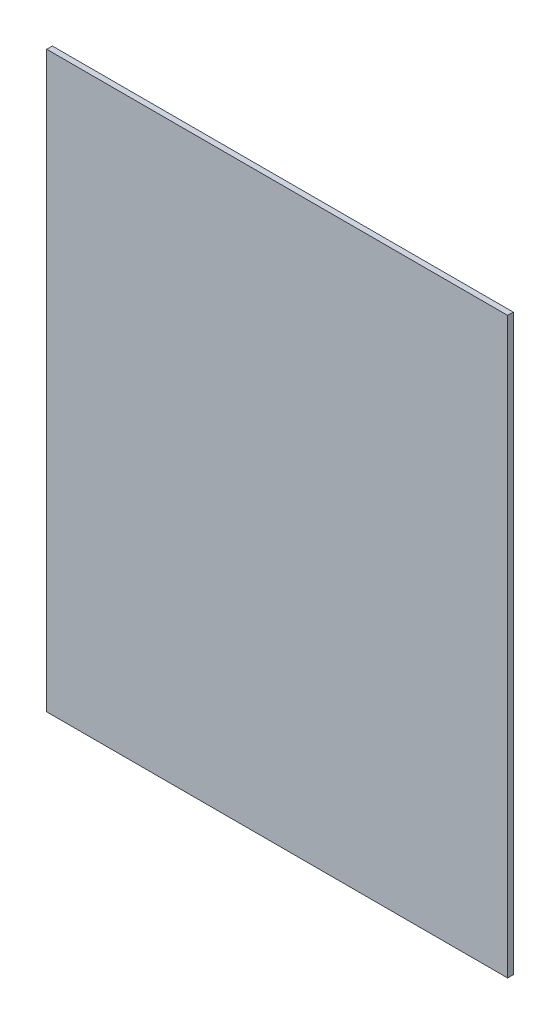
ISO-10303-21;
HEADER;
FILE_DESCRIPTION(('STEP AP214'),'2;1');
FILE_NAME('part.step','',(''),(''),'','','');
FILE_SCHEMA(('AUTOMOTIVE_DESIGN { 1 0 10303 214 1 1 1 1 }'));
ENDSEC;
DATA;
#1=APPLICATION_CONTEXT('core data for automotive mechanical design processes');
#2=APPLICATION_PROTOCOL_DEFINITION('international standard','automotive_design',2000,#1);
#3=PRODUCT_CONTEXT('',#1,'mechanical');
#4=PRODUCT('Part','Part','',(#3));
#5=PRODUCT_RELATED_PRODUCT_CATEGORY('part','',(#4));
#6=PRODUCT_DEFINITION_FORMATION('','',#4);
#7=PRODUCT_DEFINITION_CONTEXT('part definition',#1,'design');
#8=PRODUCT_DEFINITION('design','',#6,#7);
#9=PRODUCT_DEFINITION_SHAPE('','',#8);
#10=(LENGTH_UNIT() NAMED_UNIT(*) SI_UNIT(.MILLI.,.METRE.));
#11=(NAMED_UNIT(*) PLANE_ANGLE_UNIT() SI_UNIT($,.RADIAN.));
#12=(NAMED_UNIT(*) SI_UNIT($,.STERADIAN.) SOLID_ANGLE_UNIT());
#13=UNCERTAINTY_MEASURE_WITH_UNIT(LENGTH_MEASURE(1.E-05),#10,'distance_accuracy_value','');
#14=(GEOMETRIC_REPRESENTATION_CONTEXT(3) GLOBAL_UNCERTAINTY_ASSIGNED_CONTEXT((#13)) GLOBAL_UNIT_ASSIGNED_CONTEXT((#10,
#11,#12)) REPRESENTATION_CONTEXT('',''));
#15=CARTESIAN_POINT('',(0.,0.,0.));
#16=DIRECTION('',(0.,0.,1.));
#17=DIRECTION('',(1.,0.,0.));
#18=AXIS2_PLACEMENT_3D('',#15,#16,#17);
#19=CARTESIAN_POINT('',(0.,498.,4.9));
#20=DIRECTION('',(0.,1.,0.));
#21=DIRECTION('',(0.,0.,1.));
#22=AXIS2_PLACEMENT_3D('',#19,#20,#21);
#23=PLANE('',#22);
#24=DIRECTION('',(1.,0.,0.));
#25=VECTOR('',#24,1.);
#26=CARTESIAN_POINT('',(0.,498.,0.));
#27=LINE('',#26,#25);
#28=CARTESIAN_POINT('',(0.,498.,0.));
#29=VERTEX_POINT('',#28);
#30=CARTESIAN_POINT('',(400.,498.,0.));
#31=VERTEX_POINT('',#30);
#32=EDGE_CURVE('E99',#29,#31,#27,.T.);
#33=ORIENTED_EDGE('',*,*,#32,.F.);
#34=DIRECTION('',(0.,0.,-1.));
#35=VECTOR('',#34,1.);
#36=CARTESIAN_POINT('',(0.,498.,4.9));
#37=LINE('',#36,#35);
#38=CARTESIAN_POINT('',(0.,498.,4.9));
#39=VERTEX_POINT('',#38);
#40=EDGE_CURVE('E11',#39,#29,#37,.T.);
#41=ORIENTED_EDGE('',*,*,#40,.F.);
#42=DIRECTION('',(1.,0.,0.));
#43=VECTOR('',#42,1.);
#44=CARTESIAN_POINT('',(0.,498.,4.9));
#45=LINE('',#44,#43);
#46=CARTESIAN_POINT('',(400.,498.,4.9));
#47=VERTEX_POINT('',#46);
#48=EDGE_CURVE('E93',#39,#47,#45,.T.);
#49=ORIENTED_EDGE('',*,*,#48,.T.);
#50=DIRECTION('',(0.,0.,-1.));
#51=VECTOR('',#50,1.);
#52=CARTESIAN_POINT('',(400.,498.,4.9));
#53=LINE('',#52,#51);
#54=EDGE_CURVE('E38',#47,#31,#53,.T.);
#55=ORIENTED_EDGE('',*,*,#54,.T.);
#56=EDGE_LOOP('',(#33,#41,#49,#55));
#57=FACE_BOUND('',#56,.T.);
#58=ADVANCED_FACE('F35',(#57),#23,.T.);
#59=CARTESIAN_POINT('',(0.,0.,4.9));
#60=DIRECTION('',(-1.,0.,0.));
#61=DIRECTION('',(0.,0.,1.));
#62=AXIS2_PLACEMENT_3D('',#59,#60,#61);
#63=PLANE('',#62);
#64=DIRECTION('',(0.,1.,0.));
#65=VECTOR('',#64,1.);
#66=CARTESIAN_POINT('',(0.,0.,0.));
#67=LINE('',#66,#65);
#68=CARTESIAN_POINT('',(0.,0.,0.));
#69=VERTEX_POINT('',#68);
#70=EDGE_CURVE('E95',#69,#29,#67,.T.);
#71=ORIENTED_EDGE('',*,*,#70,.F.);
#72=DIRECTION('',(0.,0.,-1.));
#73=VECTOR('',#72,1.);
#74=CARTESIAN_POINT('',(0.,0.,4.9));
#75=LINE('',#74,#73);
#76=CARTESIAN_POINT('',(0.,0.,4.9));
#77=VERTEX_POINT('',#76);
#78=EDGE_CURVE('E44',#77,#69,#75,.T.);
#79=ORIENTED_EDGE('',*,*,#78,.F.);
#80=DIRECTION('',(0.,1.,0.));
#81=VECTOR('',#80,1.);
#82=CARTESIAN_POINT('',(0.,0.,4.9));
#83=LINE('',#82,#81);
#84=EDGE_CURVE('E83',#77,#39,#83,.T.);
#85=ORIENTED_EDGE('',*,*,#84,.T.);
#86=ORIENTED_EDGE('',*,*,#40,.T.);
#87=EDGE_LOOP('',(#71,#79,#85,#86));
#88=FACE_BOUND('',#87,.T.);
#89=ADVANCED_FACE('F109',(#88),#63,.T.);
#90=CARTESIAN_POINT('',(0.,0.,4.9));
#91=DIRECTION('',(0.,1.,0.));
#92=DIRECTION('',(0.,0.,1.));
#93=AXIS2_PLACEMENT_3D('',#90,#91,#92);
#94=PLANE('',#93);
#95=DIRECTION('',(1.,0.,0.));
#96=VECTOR('',#95,1.);
#97=CARTESIAN_POINT('',(0.,0.,0.));
#98=LINE('',#97,#96);
#99=CARTESIAN_POINT('',(400.,0.,0.));
#100=VERTEX_POINT('',#99);
#101=EDGE_CURVE('E88',#69,#100,#98,.T.);
#102=ORIENTED_EDGE('',*,*,#101,.T.);
#103=DIRECTION('',(0.,0.,-1.));
#104=VECTOR('',#103,1.);
#105=CARTESIAN_POINT('',(400.,0.,4.9));
#106=LINE('',#105,#104);
#107=CARTESIAN_POINT('',(400.,0.,4.9));
#108=VERTEX_POINT('',#107);
#109=EDGE_CURVE('E86',#108,#100,#106,.T.);
#110=ORIENTED_EDGE('',*,*,#109,.F.);
#111=DIRECTION('',(1.,0.,0.));
#112=VECTOR('',#111,1.);
#113=CARTESIAN_POINT('',(0.,0.,4.9));
#114=LINE('',#113,#112);
#115=EDGE_CURVE('E80',#77,#108,#114,.T.);
#116=ORIENTED_EDGE('',*,*,#115,.F.);
#117=ORIENTED_EDGE('',*,*,#78,.T.);
#118=EDGE_LOOP('',(#102,#110,#116,#117));
#119=FACE_BOUND('',#118,.T.);
#120=ADVANCED_FACE('F87',(#119),#94,.F.);
#121=CARTESIAN_POINT('',(400.,0.,4.9));
#122=DIRECTION('',(-1.,0.,0.));
#123=DIRECTION('',(0.,0.,1.));
#124=AXIS2_PLACEMENT_3D('',#121,#122,#123);
#125=PLANE('',#124);
#126=DIRECTION('',(0.,1.,0.));
#127=VECTOR('',#126,1.);
#128=CARTESIAN_POINT('',(400.,0.,0.));
#129=LINE('',#128,#127);
#130=EDGE_CURVE('E102',#100,#31,#129,.T.);
#131=ORIENTED_EDGE('',*,*,#130,.T.);
#132=ORIENTED_EDGE('',*,*,#54,.F.);
#133=DIRECTION('',(0.,1.,0.));
#134=VECTOR('',#133,1.);
#135=CARTESIAN_POINT('',(400.,0.,4.9));
#136=LINE('',#135,#134);
#137=EDGE_CURVE('E77',#108,#47,#136,.T.);
#138=ORIENTED_EDGE('',*,*,#137,.F.);
#139=ORIENTED_EDGE('',*,*,#109,.T.);
#140=EDGE_LOOP('',(#131,#132,#138,#139));
#141=FACE_BOUND('',#140,.T.);
#142=ADVANCED_FACE('F92',(#141),#125,.F.);
#143=CARTESIAN_POINT('',(0.,0.,4.9));
#144=DIRECTION('',(0.,0.,1.));
#145=DIRECTION('',(1.,0.,0.));
#146=AXIS2_PLACEMENT_3D('',#143,#144,#145);
#147=PLANE('',#146);
#148=ORIENTED_EDGE('',*,*,#48,.F.);
#149=ORIENTED_EDGE('',*,*,#84,.F.);
#150=ORIENTED_EDGE('',*,*,#115,.T.);
#151=ORIENTED_EDGE('',*,*,#137,.T.);
#152=EDGE_LOOP('',(#148,#149,#150,#151));
#153=FACE_BOUND('',#152,.T.);
#154=ADVANCED_FACE('F82',(#153),#147,.T.);
#155=CARTESIAN_POINT('',(0.,0.,0.));
#156=DIRECTION('',(0.,0.,1.));
#157=DIRECTION('',(1.,0.,0.));
#158=AXIS2_PLACEMENT_3D('',#155,#156,#157);
#159=PLANE('',#158);
#160=ORIENTED_EDGE('',*,*,#32,.T.);
#161=ORIENTED_EDGE('',*,*,#130,.F.);
#162=ORIENTED_EDGE('',*,*,#101,.F.);
#163=ORIENTED_EDGE('',*,*,#70,.T.);
#164=EDGE_LOOP('',(#160,#161,#162,#163));
#165=FACE_BOUND('',#164,.T.);
#166=ADVANCED_FACE('F108',(#165),#159,.F.);
#167=CLOSED_SHELL('',(#58,#89,#120,#142,#154,#166));
#168=MANIFOLD_SOLID_BREP('B2',#167);
#169=ADVANCED_BREP_SHAPE_REPRESENTATION('',(#18,#168),#14);
#170=SHAPE_DEFINITION_REPRESENTATION(#9,#169);
ENDSEC;
END-ISO-10303-21;
